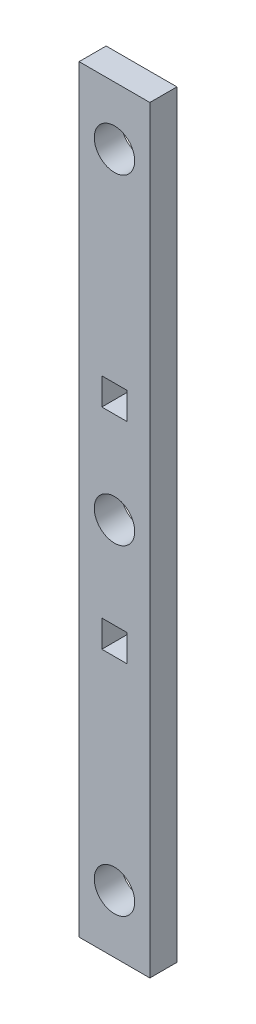
ISO-10303-21;
HEADER;
FILE_DESCRIPTION(('STEP AP214'),'2;1');
FILE_NAME('part.step','',(''),(''),'','','');
FILE_SCHEMA(('AUTOMOTIVE_DESIGN { 1 0 10303 214 1 1 1 1 }'));
ENDSEC;
DATA;
#1=APPLICATION_CONTEXT('core data for automotive mechanical design processes');
#2=APPLICATION_PROTOCOL_DEFINITION('international standard','automotive_design',2000,#1);
#3=PRODUCT_CONTEXT('',#1,'mechanical');
#4=PRODUCT('Part','Part','',(#3));
#5=PRODUCT_RELATED_PRODUCT_CATEGORY('part','',(#4));
#6=PRODUCT_DEFINITION_FORMATION('','',#4);
#7=PRODUCT_DEFINITION_CONTEXT('part definition',#1,'design');
#8=PRODUCT_DEFINITION('design','',#6,#7);
#9=PRODUCT_DEFINITION_SHAPE('','',#8);
#10=(LENGTH_UNIT() NAMED_UNIT(*) SI_UNIT(.MILLI.,.METRE.));
#11=(NAMED_UNIT(*) PLANE_ANGLE_UNIT() SI_UNIT($,.RADIAN.));
#12=(NAMED_UNIT(*) SI_UNIT($,.STERADIAN.) SOLID_ANGLE_UNIT());
#13=UNCERTAINTY_MEASURE_WITH_UNIT(LENGTH_MEASURE(1.E-05),#10,'distance_accuracy_value','');
#14=(GEOMETRIC_REPRESENTATION_CONTEXT(3) GLOBAL_UNCERTAINTY_ASSIGNED_CONTEXT((#13)) GLOBAL_UNIT_ASSIGNED_CONTEXT((#10,
#11,#12)) REPRESENTATION_CONTEXT('',''));
#15=CARTESIAN_POINT('',(0.,0.,0.));
#16=DIRECTION('',(0.,0.,1.));
#17=DIRECTION('',(1.,0.,0.));
#18=AXIS2_PLACEMENT_3D('',#15,#16,#17);
#19=CARTESIAN_POINT('',(0.,0.,5.35));
#20=DIRECTION('',(0.,0.,1.));
#21=DIRECTION('',(1.,0.,0.));
#22=AXIS2_PLACEMENT_3D('',#19,#20,#21);
#23=PLANE('',#22);
#24=CARTESIAN_POINT('',(7.00000021600003,11.5000029802,5.35));
#25=DIRECTION('',(0.,0.,1.));
#26=DIRECTION('',(1.,0.,0.));
#27=AXIS2_PLACEMENT_3D('',#24,#25,#26);
#28=CIRCLE('',#27,4.);
#29=CARTESIAN_POINT('',(11.000000216,11.5000029802,5.35));
#30=VERTEX_POINT('',#29);
#31=EDGE_CURVE('E195',#30,#30,#28,.T.);
#32=ORIENTED_EDGE('',*,*,#31,.F.);
#33=EDGE_LOOP('',(#32));
#34=FACE_BOUND('',#33,.T.);
#35=DIRECTION('',(-1.,0.,0.));
#36=VECTOR('',#35,1.);
#37=CARTESIAN_POINT('',(14.0000004321,150.0000059604,5.35));
#38=LINE('',#37,#36);
#39=CARTESIAN_POINT('',(14.0000004321,150.0000059604,5.35));
#40=VERTEX_POINT('',#39);
#41=CARTESIAN_POINT('',(0.,150.0000059604,5.35));
#42=VERTEX_POINT('',#41);
#43=EDGE_CURVE('E207',#40,#42,#38,.T.);
#44=ORIENTED_EDGE('',*,*,#43,.T.);
#45=DIRECTION('',(0.,-1.,0.));
#46=VECTOR('',#45,1.);
#47=CARTESIAN_POINT('',(0.,150.0000059604,5.35));
#48=LINE('',#47,#46);
#49=CARTESIAN_POINT('',(0.,0.,5.35));
#50=VERTEX_POINT('',#49);
#51=EDGE_CURVE('E210',#42,#50,#48,.T.);
#52=ORIENTED_EDGE('',*,*,#51,.T.);
#53=DIRECTION('',(1.,0.,0.));
#54=VECTOR('',#53,1.);
#55=CARTESIAN_POINT('',(0.,0.,5.35));
#56=LINE('',#55,#54);
#57=CARTESIAN_POINT('',(14.0000004321,0.,5.35));
#58=VERTEX_POINT('',#57);
#59=EDGE_CURVE('E213',#50,#58,#56,.T.);
#60=ORIENTED_EDGE('',*,*,#59,.T.);
#61=DIRECTION('',(0.,1.,0.));
#62=VECTOR('',#61,1.);
#63=CARTESIAN_POINT('',(14.0000004321,0.,5.35));
#64=LINE('',#63,#62);
#65=EDGE_CURVE('E215',#58,#40,#64,.T.);
#66=ORIENTED_EDGE('',*,*,#65,.T.);
#67=EDGE_LOOP('',(#44,#52,#60,#66));
#68=FACE_BOUND('',#67,.T.);
#69=CARTESIAN_POINT('',(7.00000021600003,75.0000029802001,5.35));
#70=DIRECTION('',(0.,0.,1.));
#71=DIRECTION('',(1.,0.,0.));
#72=AXIS2_PLACEMENT_3D('',#69,#70,#71);
#73=CIRCLE('',#72,4.);
#74=CARTESIAN_POINT('',(11.000000216,75.0000029802001,5.35));
#75=VERTEX_POINT('',#74);
#76=EDGE_CURVE('E201',#75,#75,#73,.T.);
#77=ORIENTED_EDGE('',*,*,#76,.F.);
#78=EDGE_LOOP('',(#77));
#79=FACE_BOUND('',#78,.T.);
#80=CARTESIAN_POINT('',(7.00000021600003,138.5000029802,5.35));
#81=DIRECTION('',(0.,0.,1.));
#82=DIRECTION('',(1.,0.,0.));
#83=AXIS2_PLACEMENT_3D('',#80,#81,#82);
#84=CIRCLE('',#83,4.);
#85=CARTESIAN_POINT('',(11.000000216,138.5000029802,5.35));
#86=VERTEX_POINT('',#85);
#87=EDGE_CURVE('E189',#86,#86,#84,.T.);
#88=ORIENTED_EDGE('',*,*,#87,.F.);
#89=EDGE_LOOP('',(#88));
#90=FACE_BOUND('',#89,.T.);
#91=DIRECTION('',(-1.,0.,0.));
#92=VECTOR('',#91,1.);
#93=CARTESIAN_POINT('',(9.50000016010003,56.9250024855001,5.35));
#94=LINE('',#93,#92);
#95=CARTESIAN_POINT('',(9.50000016010003,56.9250024855001,5.35));
#96=VERTEX_POINT('',#95);
#97=CARTESIAN_POINT('',(4.50000027190001,56.9250024855001,5.35));
#98=VERTEX_POINT('',#97);
#99=EDGE_CURVE('E160',#96,#98,#94,.T.);
#100=ORIENTED_EDGE('',*,*,#99,.F.);
#101=DIRECTION('',(0.,1.,0.));
#102=VECTOR('',#101,1.);
#103=CARTESIAN_POINT('',(9.50000016010003,51.5750031918,5.35));
#104=LINE('',#103,#102);
#105=CARTESIAN_POINT('',(9.50000016010003,51.5750031918,5.35));
#106=VERTEX_POINT('',#105);
#107=EDGE_CURVE('E158',#106,#96,#104,.T.);
#108=ORIENTED_EDGE('',*,*,#107,.F.);
#109=DIRECTION('',(1.,0.,0.));
#110=VECTOR('',#109,1.);
#111=CARTESIAN_POINT('',(4.50000027190001,51.5750031918,5.35));
#112=LINE('',#111,#110);
#113=CARTESIAN_POINT('',(4.50000027190001,51.5750031918,5.35));
#114=VERTEX_POINT('',#113);
#115=EDGE_CURVE('E166',#114,#106,#112,.T.);
#116=ORIENTED_EDGE('',*,*,#115,.F.);
#117=DIRECTION('',(0.,-1.,0.));
#118=VECTOR('',#117,1.);
#119=CARTESIAN_POINT('',(4.50000027190001,56.9250024855001,5.35));
#120=LINE('',#119,#118);
#121=EDGE_CURVE('E163',#98,#114,#120,.T.);
#122=ORIENTED_EDGE('',*,*,#121,.F.);
#123=EDGE_LOOP('',(#100,#108,#116,#122));
#124=FACE_BOUND('',#123,.T.);
#125=DIRECTION('',(1.,0.,0.));
#126=VECTOR('',#125,1.);
#127=CARTESIAN_POINT('',(4.50000027190001,93.0750034749,5.35));
#128=LINE('',#127,#126);
#129=CARTESIAN_POINT('',(4.50000027190001,93.0750034749,5.35));
#130=VERTEX_POINT('',#129);
#131=CARTESIAN_POINT('',(9.50000016010003,93.0750034749,5.35));
#132=VERTEX_POINT('',#131);
#133=EDGE_CURVE('E130',#130,#132,#128,.T.);
#134=ORIENTED_EDGE('',*,*,#133,.F.);
#135=DIRECTION('',(0.,-1.,0.));
#136=VECTOR('',#135,1.);
#137=CARTESIAN_POINT('',(4.50000027190001,98.4250027686,5.35));
#138=LINE('',#137,#136);
#139=CARTESIAN_POINT('',(4.50000027190001,98.4250027686,5.35));
#140=VERTEX_POINT('',#139);
#141=EDGE_CURVE('E122',#140,#130,#138,.T.);
#142=ORIENTED_EDGE('',*,*,#141,.F.);
#143=DIRECTION('',(-1.,0.,0.));
#144=VECTOR('',#143,1.);
#145=CARTESIAN_POINT('',(9.50000016010003,98.4250027686,5.35));
#146=LINE('',#145,#144);
#147=CARTESIAN_POINT('',(9.50000016010003,98.4250027686,5.35));
#148=VERTEX_POINT('',#147);
#149=EDGE_CURVE('E144',#148,#140,#146,.T.);
#150=ORIENTED_EDGE('',*,*,#149,.F.);
#151=DIRECTION('',(0.,1.,0.));
#152=VECTOR('',#151,1.);
#153=CARTESIAN_POINT('',(9.50000016010003,93.0750034749,5.35));
#154=LINE('',#153,#152);
#155=EDGE_CURVE('E142',#132,#148,#154,.T.);
#156=ORIENTED_EDGE('',*,*,#155,.F.);
#157=EDGE_LOOP('',(#134,#142,#150,#156));
#158=FACE_BOUND('',#157,.T.);
#159=ADVANCED_FACE('F33',(#34,#68,#79,#90,#124,#158),#23,.T.);
#160=CARTESIAN_POINT('',(0.,0.,0.));
#161=DIRECTION('',(0.,0.,1.));
#162=DIRECTION('',(1.,0.,0.));
#163=AXIS2_PLACEMENT_3D('',#160,#161,#162);
#164=PLANE('',#163);
#165=DIRECTION('',(0.,1.,0.));
#166=VECTOR('',#165,1.);
#167=CARTESIAN_POINT('',(9.50000016010003,51.5750031918,0.));
#168=LINE('',#167,#166);
#169=CARTESIAN_POINT('',(9.50000016010003,51.5750031918,0.));
#170=VERTEX_POINT('',#169);
#171=CARTESIAN_POINT('',(9.50000016010003,56.9250024855001,0.));
#172=VERTEX_POINT('',#171);
#173=EDGE_CURVE('E138',#170,#172,#168,.T.);
#174=ORIENTED_EDGE('',*,*,#173,.T.);
#175=DIRECTION('',(-1.,0.,0.));
#176=VECTOR('',#175,1.);
#177=CARTESIAN_POINT('',(9.50000016010003,56.9250024855001,0.));
#178=LINE('',#177,#176);
#179=CARTESIAN_POINT('',(4.50000027190001,56.9250024855001,0.));
#180=VERTEX_POINT('',#179);
#181=EDGE_CURVE('E171',#172,#180,#178,.T.);
#182=ORIENTED_EDGE('',*,*,#181,.T.);
#183=DIRECTION('',(0.,-1.,0.));
#184=VECTOR('',#183,1.);
#185=CARTESIAN_POINT('',(4.50000027190001,56.9250024855001,0.));
#186=LINE('',#185,#184);
#187=CARTESIAN_POINT('',(4.50000027190001,51.5750031918,0.));
#188=VERTEX_POINT('',#187);
#189=EDGE_CURVE('E174',#180,#188,#186,.T.);
#190=ORIENTED_EDGE('',*,*,#189,.T.);
#191=DIRECTION('',(1.,0.,0.));
#192=VECTOR('',#191,1.);
#193=CARTESIAN_POINT('',(4.50000027190001,51.5750031918,0.));
#194=LINE('',#193,#192);
#195=EDGE_CURVE('E161',#188,#170,#194,.T.);
#196=ORIENTED_EDGE('',*,*,#195,.T.);
#197=EDGE_LOOP('',(#174,#182,#190,#196));
#198=FACE_BOUND('',#197,.T.);
#199=DIRECTION('',(-1.,0.,0.));
#200=VECTOR('',#199,1.);
#201=CARTESIAN_POINT('',(14.0000004321,150.0000059604,0.));
#202=LINE('',#201,#200);
#203=CARTESIAN_POINT('',(14.0000004321,150.0000059604,0.));
#204=VERTEX_POINT('',#203);
#205=CARTESIAN_POINT('',(0.,150.0000059604,0.));
#206=VERTEX_POINT('',#205);
#207=EDGE_CURVE('E204',#204,#206,#202,.T.);
#208=ORIENTED_EDGE('',*,*,#207,.F.);
#209=DIRECTION('',(0.,1.,0.));
#210=VECTOR('',#209,1.);
#211=CARTESIAN_POINT('',(14.0000004321,0.,0.));
#212=LINE('',#211,#210);
#213=CARTESIAN_POINT('',(14.0000004321,0.,0.));
#214=VERTEX_POINT('',#213);
#215=EDGE_CURVE('E211',#214,#204,#212,.T.);
#216=ORIENTED_EDGE('',*,*,#215,.F.);
#217=DIRECTION('',(1.,0.,0.));
#218=VECTOR('',#217,1.);
#219=CARTESIAN_POINT('',(0.,0.,0.));
#220=LINE('',#219,#218);
#221=CARTESIAN_POINT('',(0.,0.,0.));
#222=VERTEX_POINT('',#221);
#223=EDGE_CURVE('E222',#222,#214,#220,.T.);
#224=ORIENTED_EDGE('',*,*,#223,.F.);
#225=DIRECTION('',(0.,-1.,0.));
#226=VECTOR('',#225,1.);
#227=CARTESIAN_POINT('',(0.,150.0000059604,0.));
#228=LINE('',#227,#226);
#229=EDGE_CURVE('E220',#206,#222,#228,.T.);
#230=ORIENTED_EDGE('',*,*,#229,.F.);
#231=EDGE_LOOP('',(#208,#216,#224,#230));
#232=FACE_BOUND('',#231,.T.);
#233=CARTESIAN_POINT('',(7.00000021600003,75.0000029802001,0.));
#234=DIRECTION('',(0.,0.,1.));
#235=DIRECTION('',(1.,0.,0.));
#236=AXIS2_PLACEMENT_3D('',#233,#234,#235);
#237=CIRCLE('',#236,4.);
#238=CARTESIAN_POINT('',(11.000000216,75.0000029802001,0.));
#239=VERTEX_POINT('',#238);
#240=EDGE_CURVE('E198',#239,#239,#237,.T.);
#241=ORIENTED_EDGE('',*,*,#240,.T.);
#242=EDGE_LOOP('',(#241));
#243=FACE_BOUND('',#242,.T.);
#244=CARTESIAN_POINT('',(7.00000021600003,11.5000029802,0.));
#245=DIRECTION('',(0.,0.,1.));
#246=DIRECTION('',(1.,0.,0.));
#247=AXIS2_PLACEMENT_3D('',#244,#245,#246);
#248=CIRCLE('',#247,4.);
#249=CARTESIAN_POINT('',(11.000000216,11.5000029802,0.));
#250=VERTEX_POINT('',#249);
#251=EDGE_CURVE('E192',#250,#250,#248,.T.);
#252=ORIENTED_EDGE('',*,*,#251,.T.);
#253=EDGE_LOOP('',(#252));
#254=FACE_BOUND('',#253,.T.);
#255=CARTESIAN_POINT('',(7.00000021600003,138.5000029802,0.));
#256=DIRECTION('',(0.,0.,1.));
#257=DIRECTION('',(1.,0.,0.));
#258=AXIS2_PLACEMENT_3D('',#255,#256,#257);
#259=CIRCLE('',#258,4.);
#260=CARTESIAN_POINT('',(11.000000216,138.5000029802,0.));
#261=VERTEX_POINT('',#260);
#262=EDGE_CURVE('E188',#261,#261,#259,.T.);
#263=ORIENTED_EDGE('',*,*,#262,.T.);
#264=EDGE_LOOP('',(#263));
#265=FACE_BOUND('',#264,.T.);
#266=DIRECTION('',(0.,-1.,0.));
#267=VECTOR('',#266,1.);
#268=CARTESIAN_POINT('',(4.50000027190001,98.4250027686,0.));
#269=LINE('',#268,#267);
#270=CARTESIAN_POINT('',(4.50000027190001,98.4250027686,0.));
#271=VERTEX_POINT('',#270);
#272=CARTESIAN_POINT('',(4.50000027190001,93.0750034749,0.));
#273=VERTEX_POINT('',#272);
#274=EDGE_CURVE('E56',#271,#273,#269,.T.);
#275=ORIENTED_EDGE('',*,*,#274,.T.);
#276=DIRECTION('',(1.,0.,0.));
#277=VECTOR('',#276,1.);
#278=CARTESIAN_POINT('',(4.50000027190001,93.0750034749,0.));
#279=LINE('',#278,#277);
#280=CARTESIAN_POINT('',(9.50000016010003,93.0750034749,0.));
#281=VERTEX_POINT('',#280);
#282=EDGE_CURVE('E137',#273,#281,#279,.T.);
#283=ORIENTED_EDGE('',*,*,#282,.T.);
#284=DIRECTION('',(0.,1.,0.));
#285=VECTOR('',#284,1.);
#286=CARTESIAN_POINT('',(9.50000016010003,93.0750034749,0.));
#287=LINE('',#286,#285);
#288=CARTESIAN_POINT('',(9.50000016010003,98.4250027686,0.));
#289=VERTEX_POINT('',#288);
#290=EDGE_CURVE('E150',#281,#289,#287,.T.);
#291=ORIENTED_EDGE('',*,*,#290,.T.);
#292=DIRECTION('',(-1.,0.,0.));
#293=VECTOR('',#292,1.);
#294=CARTESIAN_POINT('',(9.50000016010003,98.4250027686,0.));
#295=LINE('',#294,#293);
#296=EDGE_CURVE('E131',#289,#271,#295,.T.);
#297=ORIENTED_EDGE('',*,*,#296,.T.);
#298=EDGE_LOOP('',(#275,#283,#291,#297));
#299=FACE_BOUND('',#298,.T.);
#300=ADVANCED_FACE('F240',(#198,#232,#243,#254,#265,#299),#164,.F.);
#301=CARTESIAN_POINT('',(14.0000004321,150.0000059604,5.35));
#302=DIRECTION('',(0.,-1.,0.));
#303=DIRECTION('',(0.,0.,-1.));
#304=AXIS2_PLACEMENT_3D('',#301,#302,#303);
#305=PLANE('',#304);
#306=ORIENTED_EDGE('',*,*,#207,.T.);
#307=DIRECTION('',(0.,0.,-1.));
#308=VECTOR('',#307,1.);
#309=CARTESIAN_POINT('',(0.,150.0000059604,5.35));
#310=LINE('',#309,#308);
#311=EDGE_CURVE('E11',#42,#206,#310,.T.);
#312=ORIENTED_EDGE('',*,*,#311,.F.);
#313=ORIENTED_EDGE('',*,*,#43,.F.);
#314=DIRECTION('',(0.,0.,-1.));
#315=VECTOR('',#314,1.);
#316=CARTESIAN_POINT('',(14.0000004321,150.0000059604,5.35));
#317=LINE('',#316,#315);
#318=EDGE_CURVE('E217',#40,#204,#317,.T.);
#319=ORIENTED_EDGE('',*,*,#318,.T.);
#320=EDGE_LOOP('',(#306,#312,#313,#319));
#321=FACE_BOUND('',#320,.T.);
#322=ADVANCED_FACE('F35',(#321),#305,.F.);
#323=CARTESIAN_POINT('',(0.,150.0000059604,5.35));
#324=DIRECTION('',(1.,0.,0.));
#325=DIRECTION('',(0.,0.,-1.));
#326=AXIS2_PLACEMENT_3D('',#323,#324,#325);
#327=PLANE('',#326);
#328=ORIENTED_EDGE('',*,*,#229,.T.);
#329=DIRECTION('',(0.,0.,-1.));
#330=VECTOR('',#329,1.);
#331=CARTESIAN_POINT('',(0.,0.,5.35));
#332=LINE('',#331,#330);
#333=EDGE_CURVE('E41',#50,#222,#332,.T.);
#334=ORIENTED_EDGE('',*,*,#333,.F.);
#335=ORIENTED_EDGE('',*,*,#51,.F.);
#336=ORIENTED_EDGE('',*,*,#311,.T.);
#337=EDGE_LOOP('',(#328,#334,#335,#336));
#338=FACE_BOUND('',#337,.T.);
#339=ADVANCED_FACE('F251',(#338),#327,.F.);
#340=CARTESIAN_POINT('',(0.,0.,5.35));
#341=DIRECTION('',(0.,1.,0.));
#342=DIRECTION('',(0.,0.,1.));
#343=AXIS2_PLACEMENT_3D('',#340,#341,#342);
#344=PLANE('',#343);
#345=ORIENTED_EDGE('',*,*,#223,.T.);
#346=DIRECTION('',(0.,0.,-1.));
#347=VECTOR('',#346,1.);
#348=CARTESIAN_POINT('',(14.0000004321,0.,5.35));
#349=LINE('',#348,#347);
#350=EDGE_CURVE('E227',#58,#214,#349,.T.);
#351=ORIENTED_EDGE('',*,*,#350,.F.);
#352=ORIENTED_EDGE('',*,*,#59,.F.);
#353=ORIENTED_EDGE('',*,*,#333,.T.);
#354=EDGE_LOOP('',(#345,#351,#352,#353));
#355=FACE_BOUND('',#354,.T.);
#356=ADVANCED_FACE('F234',(#355),#344,.F.);
#357=CARTESIAN_POINT('',(14.0000004321,0.,5.35));
#358=DIRECTION('',(-1.,0.,0.));
#359=DIRECTION('',(0.,0.,1.));
#360=AXIS2_PLACEMENT_3D('',#357,#358,#359);
#361=PLANE('',#360);
#362=ORIENTED_EDGE('',*,*,#215,.T.);
#363=ORIENTED_EDGE('',*,*,#318,.F.);
#364=ORIENTED_EDGE('',*,*,#65,.F.);
#365=ORIENTED_EDGE('',*,*,#350,.T.);
#366=EDGE_LOOP('',(#362,#363,#364,#365));
#367=FACE_BOUND('',#366,.T.);
#368=ADVANCED_FACE('F244',(#367),#361,.F.);
#369=CARTESIAN_POINT('',(7.00000021600003,75.0000029802001,5.35));
#370=DIRECTION('',(0.,0.,-1.));
#371=DIRECTION('',(-1.,0.,0.));
#372=AXIS2_PLACEMENT_3D('',#369,#370,#371);
#373=CYLINDRICAL_SURFACE('',#372,4.);
#374=ORIENTED_EDGE('',*,*,#76,.T.);
#375=EDGE_LOOP('',(#374));
#376=FACE_BOUND('',#375,.T.);
#377=ORIENTED_EDGE('',*,*,#240,.F.);
#378=EDGE_LOOP('',(#377));
#379=FACE_BOUND('',#378,.T.);
#380=ADVANCED_FACE('F268',(#376,#379),#373,.F.);
#381=CARTESIAN_POINT('',(7.00000021600003,11.5000029802,5.35));
#382=DIRECTION('',(0.,0.,-1.));
#383=DIRECTION('',(-1.,0.,0.));
#384=AXIS2_PLACEMENT_3D('',#381,#382,#383);
#385=CYLINDRICAL_SURFACE('',#384,4.);
#386=ORIENTED_EDGE('',*,*,#31,.T.);
#387=EDGE_LOOP('',(#386));
#388=FACE_BOUND('',#387,.T.);
#389=ORIENTED_EDGE('',*,*,#251,.F.);
#390=EDGE_LOOP('',(#389));
#391=FACE_BOUND('',#390,.T.);
#392=ADVANCED_FACE('F275',(#388,#391),#385,.F.);
#393=CARTESIAN_POINT('',(7.00000021600003,138.5000029802,5.35));
#394=DIRECTION('',(0.,0.,-1.));
#395=DIRECTION('',(-1.,0.,0.));
#396=AXIS2_PLACEMENT_3D('',#393,#394,#395);
#397=CYLINDRICAL_SURFACE('',#396,4.);
#398=ORIENTED_EDGE('',*,*,#87,.T.);
#399=EDGE_LOOP('',(#398));
#400=FACE_BOUND('',#399,.T.);
#401=ORIENTED_EDGE('',*,*,#262,.F.);
#402=EDGE_LOOP('',(#401));
#403=FACE_BOUND('',#402,.T.);
#404=ADVANCED_FACE('F280',(#400,#403),#397,.F.);
#405=CARTESIAN_POINT('',(9.50000016010003,51.5750031918,5.35));
#406=DIRECTION('',(-1.,0.,0.));
#407=DIRECTION('',(0.,0.,1.));
#408=AXIS2_PLACEMENT_3D('',#405,#406,#407);
#409=PLANE('',#408);
#410=ORIENTED_EDGE('',*,*,#173,.F.);
#411=DIRECTION('',(0.,0.,-1.));
#412=VECTOR('',#411,1.);
#413=CARTESIAN_POINT('',(9.50000016010003,51.5750031918,5.35));
#414=LINE('',#413,#412);
#415=EDGE_CURVE('E168',#106,#170,#414,.T.);
#416=ORIENTED_EDGE('',*,*,#415,.F.);
#417=ORIENTED_EDGE('',*,*,#107,.T.);
#418=DIRECTION('',(0.,0.,-1.));
#419=VECTOR('',#418,1.);
#420=CARTESIAN_POINT('',(9.50000016010003,56.9250024855001,5.35));
#421=LINE('',#420,#419);
#422=EDGE_CURVE('E185',#96,#172,#421,.T.);
#423=ORIENTED_EDGE('',*,*,#422,.T.);
#424=EDGE_LOOP('',(#410,#416,#417,#423));
#425=FACE_BOUND('',#424,.T.);
#426=ADVANCED_FACE('F316',(#425),#409,.T.);
#427=CARTESIAN_POINT('',(9.50000016010003,56.9250024855001,5.35));
#428=DIRECTION('',(0.,-1.,0.));
#429=DIRECTION('',(0.,0.,-1.));
#430=AXIS2_PLACEMENT_3D('',#427,#428,#429);
#431=PLANE('',#430);
#432=ORIENTED_EDGE('',*,*,#181,.F.);
#433=ORIENTED_EDGE('',*,*,#422,.F.);
#434=ORIENTED_EDGE('',*,*,#99,.T.);
#435=DIRECTION('',(0.,0.,-1.));
#436=VECTOR('',#435,1.);
#437=CARTESIAN_POINT('',(4.50000027190001,56.9250024855001,5.35));
#438=LINE('',#437,#436);
#439=EDGE_CURVE('E183',#98,#180,#438,.T.);
#440=ORIENTED_EDGE('',*,*,#439,.T.);
#441=EDGE_LOOP('',(#432,#433,#434,#440));
#442=FACE_BOUND('',#441,.T.);
#443=ADVANCED_FACE('F312',(#442),#431,.T.);
#444=CARTESIAN_POINT('',(4.50000027190001,56.9250024855001,5.35));
#445=DIRECTION('',(1.,0.,0.));
#446=DIRECTION('',(0.,0.,-1.));
#447=AXIS2_PLACEMENT_3D('',#444,#445,#446);
#448=PLANE('',#447);
#449=ORIENTED_EDGE('',*,*,#189,.F.);
#450=ORIENTED_EDGE('',*,*,#439,.F.);
#451=ORIENTED_EDGE('',*,*,#121,.T.);
#452=DIRECTION('',(0.,0.,-1.));
#453=VECTOR('',#452,1.);
#454=CARTESIAN_POINT('',(4.50000027190001,51.5750031918,5.35));
#455=LINE('',#454,#453);
#456=EDGE_CURVE('E181',#114,#188,#455,.T.);
#457=ORIENTED_EDGE('',*,*,#456,.T.);
#458=EDGE_LOOP('',(#449,#450,#451,#457));
#459=FACE_BOUND('',#458,.T.);
#460=ADVANCED_FACE('F308',(#459),#448,.T.);
#461=CARTESIAN_POINT('',(4.50000027190001,51.5750031918,5.35));
#462=DIRECTION('',(0.,1.,0.));
#463=DIRECTION('',(0.,0.,1.));
#464=AXIS2_PLACEMENT_3D('',#461,#462,#463);
#465=PLANE('',#464);
#466=ORIENTED_EDGE('',*,*,#195,.F.);
#467=ORIENTED_EDGE('',*,*,#456,.F.);
#468=ORIENTED_EDGE('',*,*,#115,.T.);
#469=ORIENTED_EDGE('',*,*,#415,.T.);
#470=EDGE_LOOP('',(#466,#467,#468,#469));
#471=FACE_BOUND('',#470,.T.);
#472=ADVANCED_FACE('F305',(#471),#465,.T.);
#473=CARTESIAN_POINT('',(4.50000027190001,98.4250027686,5.35));
#474=DIRECTION('',(1.,0.,0.));
#475=DIRECTION('',(0.,0.,-1.));
#476=AXIS2_PLACEMENT_3D('',#473,#474,#475);
#477=PLANE('',#476);
#478=ORIENTED_EDGE('',*,*,#274,.F.);
#479=DIRECTION('',(0.,0.,-1.));
#480=VECTOR('',#479,1.);
#481=CARTESIAN_POINT('',(4.50000027190001,98.4250027686,5.35));
#482=LINE('',#481,#480);
#483=EDGE_CURVE('E126',#140,#271,#482,.T.);
#484=ORIENTED_EDGE('',*,*,#483,.F.);
#485=ORIENTED_EDGE('',*,*,#141,.T.);
#486=DIRECTION('',(0.,0.,-1.));
#487=VECTOR('',#486,1.);
#488=CARTESIAN_POINT('',(4.50000027190001,93.0750034749,5.35));
#489=LINE('',#488,#487);
#490=EDGE_CURVE('E125',#130,#273,#489,.T.);
#491=ORIENTED_EDGE('',*,*,#490,.T.);
#492=EDGE_LOOP('',(#478,#484,#485,#491));
#493=FACE_BOUND('',#492,.T.);
#494=ADVANCED_FACE('F124',(#493),#477,.T.);
#495=CARTESIAN_POINT('',(4.50000027190001,93.0750034749,5.35));
#496=DIRECTION('',(0.,1.,0.));
#497=DIRECTION('',(0.,0.,1.));
#498=AXIS2_PLACEMENT_3D('',#495,#496,#497);
#499=PLANE('',#498);
#500=ORIENTED_EDGE('',*,*,#282,.F.);
#501=ORIENTED_EDGE('',*,*,#490,.F.);
#502=ORIENTED_EDGE('',*,*,#133,.T.);
#503=DIRECTION('',(0.,0.,-1.));
#504=VECTOR('',#503,1.);
#505=CARTESIAN_POINT('',(9.50000016010003,93.0750034749,5.35));
#506=LINE('',#505,#504);
#507=EDGE_CURVE('E139',#132,#281,#506,.T.);
#508=ORIENTED_EDGE('',*,*,#507,.T.);
#509=EDGE_LOOP('',(#500,#501,#502,#508));
#510=FACE_BOUND('',#509,.T.);
#511=ADVANCED_FACE('F134',(#510),#499,.T.);
#512=CARTESIAN_POINT('',(9.50000016010003,93.0750034749,5.35));
#513=DIRECTION('',(-1.,0.,0.));
#514=DIRECTION('',(0.,0.,1.));
#515=AXIS2_PLACEMENT_3D('',#512,#513,#514);
#516=PLANE('',#515);
#517=ORIENTED_EDGE('',*,*,#290,.F.);
#518=ORIENTED_EDGE('',*,*,#507,.F.);
#519=ORIENTED_EDGE('',*,*,#155,.T.);
#520=DIRECTION('',(0.,0.,-1.));
#521=VECTOR('',#520,1.);
#522=CARTESIAN_POINT('',(9.50000016010003,98.4250027686,5.35));
#523=LINE('',#522,#521);
#524=EDGE_CURVE('E48',#148,#289,#523,.T.);
#525=ORIENTED_EDGE('',*,*,#524,.T.);
#526=EDGE_LOOP('',(#517,#518,#519,#525));
#527=FACE_BOUND('',#526,.T.);
#528=ADVANCED_FACE('F293',(#527),#516,.T.);
#529=CARTESIAN_POINT('',(9.50000016010003,98.4250027686,5.35));
#530=DIRECTION('',(0.,-1.,0.));
#531=DIRECTION('',(0.,0.,-1.));
#532=AXIS2_PLACEMENT_3D('',#529,#530,#531);
#533=PLANE('',#532);
#534=ORIENTED_EDGE('',*,*,#296,.F.);
#535=ORIENTED_EDGE('',*,*,#524,.F.);
#536=ORIENTED_EDGE('',*,*,#149,.T.);
#537=ORIENTED_EDGE('',*,*,#483,.T.);
#538=EDGE_LOOP('',(#534,#535,#536,#537));
#539=FACE_BOUND('',#538,.T.);
#540=ADVANCED_FACE('F291',(#539),#533,.T.);
#541=CLOSED_SHELL('',(#159,#300,#322,#339,#356,#368,#380,#392,#404,#426,#443,#460,#472,#494,
#511,#528,#540));
#542=MANIFOLD_SOLID_BREP('B2',#541);
#543=ADVANCED_BREP_SHAPE_REPRESENTATION('',(#18,#542),#14);
#544=SHAPE_DEFINITION_REPRESENTATION(#9,#543);
ENDSEC;
END-ISO-10303-21;
